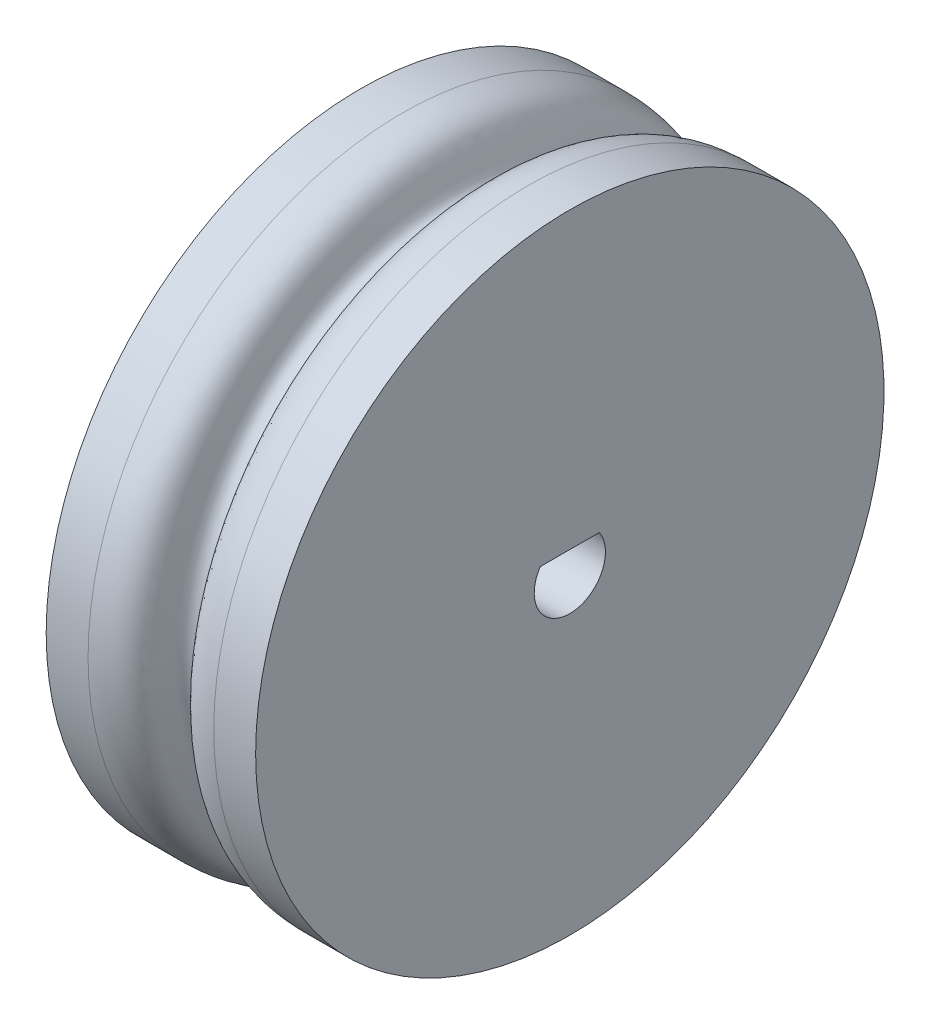
ISO-10303-21;
HEADER;
FILE_DESCRIPTION(('STEP AP214'),'2;1');
FILE_NAME('part.step','',(''),(''),'','','');
FILE_SCHEMA(('AUTOMOTIVE_DESIGN { 1 0 10303 214 1 1 1 1 }'));
ENDSEC;
DATA;
#1=APPLICATION_CONTEXT('core data for automotive mechanical design processes');
#2=APPLICATION_PROTOCOL_DEFINITION('international standard','automotive_design',2000,#1);
#3=PRODUCT_CONTEXT('',#1,'mechanical');
#4=PRODUCT('Part','Part','',(#3));
#5=PRODUCT_RELATED_PRODUCT_CATEGORY('part','',(#4));
#6=PRODUCT_DEFINITION_FORMATION('','',#4);
#7=PRODUCT_DEFINITION_CONTEXT('part definition',#1,'design');
#8=PRODUCT_DEFINITION('design','',#6,#7);
#9=PRODUCT_DEFINITION_SHAPE('','',#8);
#10=(LENGTH_UNIT() NAMED_UNIT(*) SI_UNIT(.MILLI.,.METRE.));
#11=(NAMED_UNIT(*) PLANE_ANGLE_UNIT() SI_UNIT($,.RADIAN.));
#12=(NAMED_UNIT(*) SI_UNIT($,.STERADIAN.) SOLID_ANGLE_UNIT());
#13=UNCERTAINTY_MEASURE_WITH_UNIT(LENGTH_MEASURE(1.E-05),#10,'distance_accuracy_value','');
#14=(GEOMETRIC_REPRESENTATION_CONTEXT(3) GLOBAL_UNCERTAINTY_ASSIGNED_CONTEXT((#13)) GLOBAL_UNIT_ASSIGNED_CONTEXT((#10,
#11,#12)) REPRESENTATION_CONTEXT('',''));
#15=CARTESIAN_POINT('',(0.,0.,0.));
#16=DIRECTION('',(0.,0.,1.));
#17=DIRECTION('',(1.,0.,0.));
#18=AXIS2_PLACEMENT_3D('',#15,#16,#17);
#19=CARTESIAN_POINT('',(6.00000000000007,30.,0.));
#20=CARTESIAN_POINT('',(0.191816930732567,30.,0.));
#21=CARTESIAN_POINT('',(2.935087375782,25.,0.));
#22=CARTESIAN_POINT('',(0.,25.,0.));
#23=B_SPLINE_CURVE_WITH_KNOTS('',3,(#19,#20,#21,#22),.UNSPECIFIED.,.F.,.F.,(4,4),(0.,1.),.UNSPECIFIED.);
#24=CARTESIAN_POINT('',(0.,0.,0.));
#25=DIRECTION('',(-1.,0.,0.));
#26=AXIS1_PLACEMENT('',#24,#25);
#27=SURFACE_OF_REVOLUTION('',#23,#26);
#28=CARTESIAN_POINT('',(0.,0.,0.));
#29=DIRECTION('',(-1.,0.,0.));
#30=DIRECTION('',(0.,0.,1.));
#31=AXIS2_PLACEMENT_3D('',#28,#29,#30);
#32=CIRCLE('',#31,25.);
#33=CARTESIAN_POINT('',(0.,0.,25.));
#34=VERTEX_POINT('',#33);
#35=EDGE_CURVE('E107',#34,#34,#32,.T.);
#36=ORIENTED_EDGE('',*,*,#35,.F.);
#37=EDGE_LOOP('',(#36));
#38=FACE_BOUND('',#37,.T.);
#39=CARTESIAN_POINT('',(6.00000000000001,0.,0.));
#40=DIRECTION('',(-1.,0.,0.));
#41=DIRECTION('',(0.,0.,1.));
#42=AXIS2_PLACEMENT_3D('',#39,#40,#41);
#43=CIRCLE('',#42,30.);
#44=CARTESIAN_POINT('',(6.00000000000001,0.,30.));
#45=VERTEX_POINT('',#44);
#46=EDGE_CURVE('E11',#45,#45,#43,.T.);
#47=ORIENTED_EDGE('',*,*,#46,.T.);
#48=EDGE_LOOP('',(#47));
#49=FACE_BOUND('',#48,.T.);
#50=ADVANCED_FACE('F32',(#38,#49),#27,.T.);
#51=CARTESIAN_POINT('',(0.,0.,0.));
#52=DIRECTION('',(-1.,0.,0.));
#53=DIRECTION('',(0.,0.,1.));
#54=AXIS2_PLACEMENT_3D('',#51,#52,#53);
#55=CYLINDRICAL_SURFACE('',#54,30.);
#56=ORIENTED_EDGE('',*,*,#46,.F.);
#57=EDGE_LOOP('',(#56));
#58=FACE_BOUND('',#57,.T.);
#59=CARTESIAN_POINT('',(10.,0.,0.));
#60=DIRECTION('',(-1.,0.,0.));
#61=DIRECTION('',(0.,0.,1.));
#62=AXIS2_PLACEMENT_3D('',#59,#60,#61);
#63=CIRCLE('',#62,30.);
#64=CARTESIAN_POINT('',(10.,0.,30.));
#65=VERTEX_POINT('',#64);
#66=EDGE_CURVE('E40',#65,#65,#63,.T.);
#67=ORIENTED_EDGE('',*,*,#66,.T.);
#68=EDGE_LOOP('',(#67));
#69=FACE_BOUND('',#68,.T.);
#70=ADVANCED_FACE('F96',(#58,#69),#55,.T.);
#71=CARTESIAN_POINT('',(10.,0.,0.));
#72=DIRECTION('',(-1.,0.,0.));
#73=DIRECTION('',(0.,0.,1.));
#74=AXIS2_PLACEMENT_3D('',#71,#72,#73);
#75=PLANE('',#74);
#76=DIRECTION('',(0.,0.,1.));
#77=VECTOR('',#76,1.);
#78=CARTESIAN_POINT('',(10.,1.9,2.81957443597434));
#79=LINE('',#78,#77);
#80=CARTESIAN_POINT('',(10.,1.9,-2.81957443597434));
#81=VERTEX_POINT('',#80);
#82=CARTESIAN_POINT('',(10.,1.9,2.81957443597434));
#83=VERTEX_POINT('',#82);
#84=EDGE_CURVE('E67',#81,#83,#79,.T.);
#85=ORIENTED_EDGE('',*,*,#84,.F.);
#86=CARTESIAN_POINT('',(10.,0.,0.));
#87=DIRECTION('',(1.,0.,0.));
#88=DIRECTION('',(0.,0.,-1.));
#89=AXIS2_PLACEMENT_3D('',#86,#87,#88);
#90=CIRCLE('',#89,3.4);
#91=EDGE_CURVE('E47',#83,#81,#90,.T.);
#92=ORIENTED_EDGE('',*,*,#91,.F.);
#93=EDGE_LOOP('',(#85,#92));
#94=FACE_BOUND('',#93,.T.);
#95=ORIENTED_EDGE('',*,*,#66,.F.);
#96=EDGE_LOOP('',(#95));
#97=FACE_BOUND('',#96,.T.);
#98=ADVANCED_FACE('F71',(#94,#97),#75,.F.);
#99=CARTESIAN_POINT('',(-6.00000000000007,30.,0.));
#100=CARTESIAN_POINT('',(-0.191816930732567,30.,0.));
#101=CARTESIAN_POINT('',(-2.935087375782,25.,0.));
#102=CARTESIAN_POINT('',(0.,25.,0.));
#103=B_SPLINE_CURVE_WITH_KNOTS('',3,(#99,#100,#101,#102),.UNSPECIFIED.,.F.,.F.,(4,4),(0.,1.),.UNSPECIFIED.);
#104=CARTESIAN_POINT('',(0.,0.,0.));
#105=DIRECTION('',(1.,0.,0.));
#106=AXIS1_PLACEMENT('',#104,#105);
#107=SURFACE_OF_REVOLUTION('',#103,#106);
#108=ORIENTED_EDGE('',*,*,#35,.T.);
#109=EDGE_LOOP('',(#108));
#110=FACE_BOUND('',#109,.T.);
#111=CARTESIAN_POINT('',(-6.00000000000001,0.,0.));
#112=DIRECTION('',(-1.,0.,0.));
#113=DIRECTION('',(0.,0.,1.));
#114=AXIS2_PLACEMENT_3D('',#111,#112,#113);
#115=CIRCLE('',#114,30.);
#116=CARTESIAN_POINT('',(-6.00000000000001,0.,30.));
#117=VERTEX_POINT('',#116);
#118=EDGE_CURVE('E109',#117,#117,#115,.T.);
#119=ORIENTED_EDGE('',*,*,#118,.F.);
#120=EDGE_LOOP('',(#119));
#121=FACE_BOUND('',#120,.T.);
#122=ADVANCED_FACE('F88',(#110,#121),#107,.T.);
#123=CARTESIAN_POINT('',(0.,0.,0.));
#124=DIRECTION('',(1.,0.,0.));
#125=DIRECTION('',(0.,0.,1.));
#126=AXIS2_PLACEMENT_3D('',#123,#124,#125);
#127=CYLINDRICAL_SURFACE('',#126,30.);
#128=ORIENTED_EDGE('',*,*,#118,.T.);
#129=EDGE_LOOP('',(#128));
#130=FACE_BOUND('',#129,.T.);
#131=CARTESIAN_POINT('',(-10.,0.,0.));
#132=DIRECTION('',(-1.,0.,0.));
#133=DIRECTION('',(0.,0.,1.));
#134=AXIS2_PLACEMENT_3D('',#131,#132,#133);
#135=CIRCLE('',#134,30.);
#136=CARTESIAN_POINT('',(-10.,0.,30.));
#137=VERTEX_POINT('',#136);
#138=EDGE_CURVE('E63',#137,#137,#135,.T.);
#139=ORIENTED_EDGE('',*,*,#138,.F.);
#140=EDGE_LOOP('',(#139));
#141=FACE_BOUND('',#140,.T.);
#142=ADVANCED_FACE('F92',(#130,#141),#127,.T.);
#143=CARTESIAN_POINT('',(-10.,0.,0.));
#144=DIRECTION('',(1.,0.,0.));
#145=DIRECTION('',(0.,0.,1.));
#146=AXIS2_PLACEMENT_3D('',#143,#144,#145);
#147=PLANE('',#146);
#148=DIRECTION('',(0.,0.,1.));
#149=VECTOR('',#148,1.);
#150=CARTESIAN_POINT('',(-10.,1.9,2.81957443597434));
#151=LINE('',#150,#149);
#152=CARTESIAN_POINT('',(-10.,1.9,-2.81957443597434));
#153=VERTEX_POINT('',#152);
#154=CARTESIAN_POINT('',(-10.,1.9,2.81957443597434));
#155=VERTEX_POINT('',#154);
#156=EDGE_CURVE('E75',#153,#155,#151,.T.);
#157=ORIENTED_EDGE('',*,*,#156,.T.);
#158=CARTESIAN_POINT('',(-10.,0.,0.));
#159=DIRECTION('',(1.,0.,0.));
#160=DIRECTION('',(0.,0.,-1.));
#161=AXIS2_PLACEMENT_3D('',#158,#159,#160);
#162=CIRCLE('',#161,3.4);
#163=EDGE_CURVE('E52',#155,#153,#162,.T.);
#164=ORIENTED_EDGE('',*,*,#163,.T.);
#165=EDGE_LOOP('',(#157,#164));
#166=FACE_BOUND('',#165,.T.);
#167=ORIENTED_EDGE('',*,*,#138,.T.);
#168=EDGE_LOOP('',(#167));
#169=FACE_BOUND('',#168,.T.);
#170=ADVANCED_FACE('F123',(#166,#169),#147,.F.);
#171=CARTESIAN_POINT('',(-10.,0.,0.));
#172=DIRECTION('',(1.,0.,0.));
#173=DIRECTION('',(0.,0.,-1.));
#174=AXIS2_PLACEMENT_3D('',#171,#172,#173);
#175=CYLINDRICAL_SURFACE('',#174,3.4);
#176=ORIENTED_EDGE('',*,*,#91,.T.);
#177=DIRECTION('',(1.,0.,0.));
#178=VECTOR('',#177,1.);
#179=CARTESIAN_POINT('',(-10.,1.9,-2.81957443597434));
#180=LINE('',#179,#178);
#181=EDGE_CURVE('E64',#153,#81,#180,.T.);
#182=ORIENTED_EDGE('',*,*,#181,.F.);
#183=ORIENTED_EDGE('',*,*,#163,.F.);
#184=DIRECTION('',(1.,0.,0.));
#185=VECTOR('',#184,1.);
#186=CARTESIAN_POINT('',(-10.,1.9,2.81957443597434));
#187=LINE('',#186,#185);
#188=EDGE_CURVE('E57',#155,#83,#187,.T.);
#189=ORIENTED_EDGE('',*,*,#188,.T.);
#190=EDGE_LOOP('',(#176,#182,#183,#189));
#191=FACE_BOUND('',#190,.T.);
#192=ADVANCED_FACE('F59',(#191),#175,.F.);
#193=CARTESIAN_POINT('',(-10.,1.9,2.81957443597434));
#194=DIRECTION('',(0.,1.,0.));
#195=DIRECTION('',(0.,0.,1.));
#196=AXIS2_PLACEMENT_3D('',#193,#194,#195);
#197=PLANE('',#196);
#198=ORIENTED_EDGE('',*,*,#84,.T.);
#199=ORIENTED_EDGE('',*,*,#188,.F.);
#200=ORIENTED_EDGE('',*,*,#156,.F.);
#201=ORIENTED_EDGE('',*,*,#181,.T.);
#202=EDGE_LOOP('',(#198,#199,#200,#201));
#203=FACE_BOUND('',#202,.T.);
#204=ADVANCED_FACE('F68',(#203),#197,.F.);
#205=CLOSED_SHELL('',(#50,#70,#98,#122,#142,#170,#192,#204));
#206=MANIFOLD_SOLID_BREP('B2',#205);
#207=ADVANCED_BREP_SHAPE_REPRESENTATION('',(#18,#206),#14);
#208=SHAPE_DEFINITION_REPRESENTATION(#9,#207);
ENDSEC;
END-ISO-10303-21;
